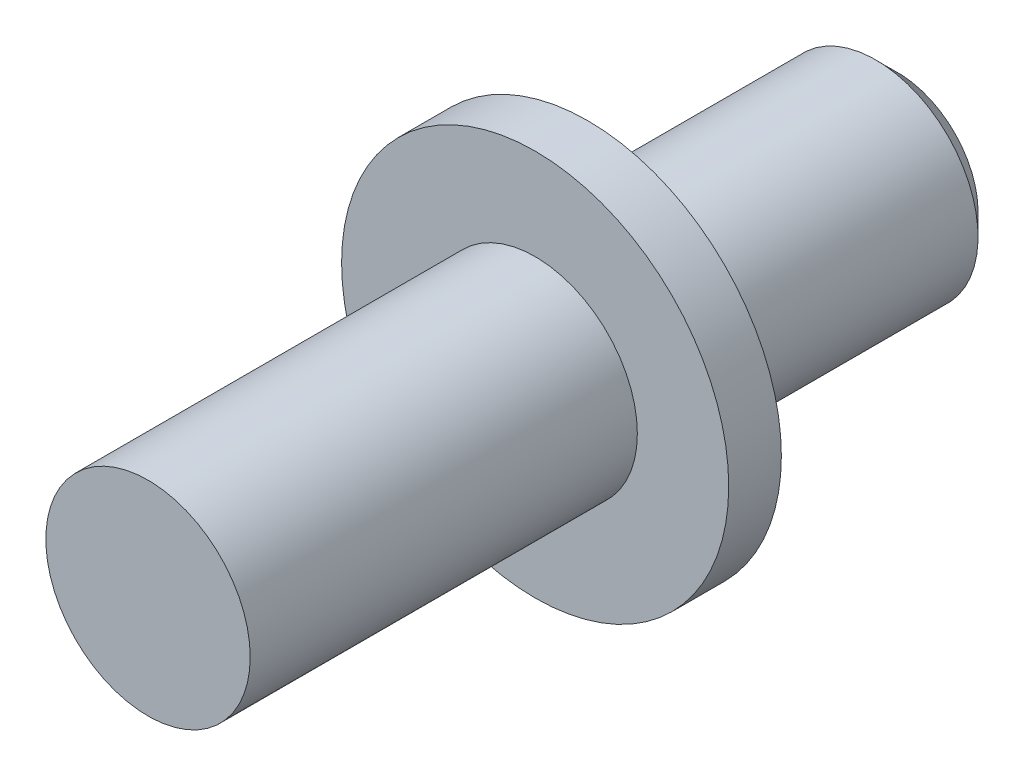
ISO-10303-21;
HEADER;
FILE_DESCRIPTION(('STEP AP214'),'2;1');
FILE_NAME('part.step','',(''),(''),'','','');
FILE_SCHEMA(('AUTOMOTIVE_DESIGN { 1 0 10303 214 1 1 1 1 }'));
ENDSEC;
DATA;
#1=APPLICATION_CONTEXT('core data for automotive mechanical design processes');
#2=APPLICATION_PROTOCOL_DEFINITION('international standard','automotive_design',2000,#1);
#3=PRODUCT_CONTEXT('',#1,'mechanical');
#4=PRODUCT('Part','Part','',(#3));
#5=PRODUCT_RELATED_PRODUCT_CATEGORY('part','',(#4));
#6=PRODUCT_DEFINITION_FORMATION('','',#4);
#7=PRODUCT_DEFINITION_CONTEXT('part definition',#1,'design');
#8=PRODUCT_DEFINITION('design','',#6,#7);
#9=PRODUCT_DEFINITION_SHAPE('','',#8);
#10=(LENGTH_UNIT() NAMED_UNIT(*) SI_UNIT(.MILLI.,.METRE.));
#11=(NAMED_UNIT(*) PLANE_ANGLE_UNIT() SI_UNIT($,.RADIAN.));
#12=(NAMED_UNIT(*) SI_UNIT($,.STERADIAN.) SOLID_ANGLE_UNIT());
#13=UNCERTAINTY_MEASURE_WITH_UNIT(LENGTH_MEASURE(1.E-05),#10,'distance_accuracy_value','');
#14=(GEOMETRIC_REPRESENTATION_CONTEXT(3) GLOBAL_UNCERTAINTY_ASSIGNED_CONTEXT((#13)) GLOBAL_UNIT_ASSIGNED_CONTEXT((#10,
#11,#12)) REPRESENTATION_CONTEXT('',''));
#15=CARTESIAN_POINT('',(0.,0.,0.));
#16=DIRECTION('',(0.,0.,1.));
#17=DIRECTION('',(1.,0.,0.));
#18=AXIS2_PLACEMENT_3D('',#15,#16,#17);
#19=CARTESIAN_POINT('',(0.,0.,-14.859));
#20=DIRECTION('',(0.,0.,1.));
#21=DIRECTION('',(1.,0.,0.));
#22=AXIS2_PLACEMENT_3D('',#19,#20,#21);
#23=PLANE('',#22);
#24=CARTESIAN_POINT('',(0.,0.,-14.8589999999444));
#25=DIRECTION('',(0.,0.,1.));
#26=DIRECTION('',(0.,-1.,0.));
#27=AXIS2_PLACEMENT_3D('',#24,#25,#26);
#28=CIRCLE('',#27,3.30200000001923);
#29=CARTESIAN_POINT('',(0.,-3.30200000001923,-14.8589999999444));
#30=VERTEX_POINT('',#29);
#31=EDGE_CURVE('E18',#30,#30,#28,.T.);
#32=ORIENTED_EDGE('',*,*,#31,.F.);
#33=EDGE_LOOP('',(#32));
#34=FACE_BOUND('',#33,.T.);
#35=ADVANCED_FACE('F15',(#34),#23,.F.);
#36=CARTESIAN_POINT('',(0.,0.,-13.9700000001426));
#37=DIRECTION('',(0.,0.,1.));
#38=DIRECTION('',(0.,-1.,0.));
#39=AXIS2_PLACEMENT_3D('',#36,#37,#38);
#40=CONICAL_SURFACE('',#39,4.19099999982109,0.785398163397448);
#41=CARTESIAN_POINT('',(0.,0.,-13.97));
#42=DIRECTION('',(0.,0.,-1.));
#43=DIRECTION('',(-1.,0.,0.));
#44=AXIS2_PLACEMENT_3D('',#41,#42,#43);
#45=CIRCLE('',#44,4.191);
#46=CARTESIAN_POINT('',(-4.191,0.,-13.97));
#47=VERTEX_POINT('',#46);
#48=EDGE_CURVE('E39',#47,#47,#45,.F.);
#49=ORIENTED_EDGE('',*,*,#48,.F.);
#50=EDGE_LOOP('',(#49));
#51=FACE_BOUND('',#50,.T.);
#52=ORIENTED_EDGE('',*,*,#31,.T.);
#53=EDGE_LOOP('',(#52));
#54=FACE_BOUND('',#53,.T.);
#55=ADVANCED_FACE('F48',(#51,#54),#40,.T.);
#56=CARTESIAN_POINT('',(0.,0.,-2.159));
#57=DIRECTION('',(0.,0.,-1.));
#58=DIRECTION('',(-1.,0.,0.));
#59=AXIS2_PLACEMENT_3D('',#56,#57,#58);
#60=CYLINDRICAL_SURFACE('',#59,4.191);
#61=ORIENTED_EDGE('',*,*,#48,.T.);
#62=EDGE_LOOP('',(#61));
#63=FACE_BOUND('',#62,.T.);
#64=CARTESIAN_POINT('',(0.,0.,-2.159));
#65=DIRECTION('',(0.,0.,-1.));
#66=DIRECTION('',(-1.,0.,0.));
#67=AXIS2_PLACEMENT_3D('',#64,#65,#66);
#68=CIRCLE('',#67,4.191);
#69=CARTESIAN_POINT('',(-4.191,0.,-2.159));
#70=VERTEX_POINT('',#69);
#71=EDGE_CURVE('E37',#70,#70,#68,.T.);
#72=ORIENTED_EDGE('',*,*,#71,.T.);
#73=EDGE_LOOP('',(#72));
#74=FACE_BOUND('',#73,.T.);
#75=ADVANCED_FACE('F55',(#63,#74),#60,.T.);
#76=CARTESIAN_POINT('',(0.,0.,-2.159));
#77=DIRECTION('',(0.,0.,1.));
#78=DIRECTION('',(1.,0.,0.));
#79=AXIS2_PLACEMENT_3D('',#76,#77,#78);
#80=PLANE('',#79);
#81=ORIENTED_EDGE('',*,*,#71,.F.);
#82=EDGE_LOOP('',(#81));
#83=FACE_BOUND('',#82,.T.);
#84=CARTESIAN_POINT('',(0.,0.,-2.159));
#85=DIRECTION('',(0.,0.,-1.));
#86=DIRECTION('',(-1.,0.,0.));
#87=AXIS2_PLACEMENT_3D('',#84,#85,#86);
#88=CIRCLE('',#87,7.9375);
#89=CARTESIAN_POINT('',(-7.9375,0.,-2.159));
#90=VERTEX_POINT('',#89);
#91=EDGE_CURVE('E35',#90,#90,#88,.F.);
#92=ORIENTED_EDGE('',*,*,#91,.F.);
#93=EDGE_LOOP('',(#92));
#94=FACE_BOUND('',#93,.T.);
#95=ADVANCED_FACE('F75',(#83,#94),#80,.F.);
#96=CARTESIAN_POINT('',(0.,0.,0.));
#97=DIRECTION('',(0.,0.,-1.));
#98=DIRECTION('',(-1.,0.,0.));
#99=AXIS2_PLACEMENT_3D('',#96,#97,#98);
#100=CYLINDRICAL_SURFACE('',#99,7.9375);
#101=CARTESIAN_POINT('',(0.,0.,0.));
#102=DIRECTION('',(0.,0.,-1.));
#103=DIRECTION('',(-1.,0.,0.));
#104=AXIS2_PLACEMENT_3D('',#101,#102,#103);
#105=CIRCLE('',#104,7.9375);
#106=CARTESIAN_POINT('',(-7.9375,0.,0.));
#107=VERTEX_POINT('',#106);
#108=EDGE_CURVE('E27',#107,#107,#105,.F.);
#109=ORIENTED_EDGE('',*,*,#108,.F.);
#110=EDGE_LOOP('',(#109));
#111=FACE_BOUND('',#110,.T.);
#112=ORIENTED_EDGE('',*,*,#91,.T.);
#113=EDGE_LOOP('',(#112));
#114=FACE_BOUND('',#113,.T.);
#115=ADVANCED_FACE('F71',(#111,#114),#100,.T.);
#116=CARTESIAN_POINT('',(0.,0.,15.875));
#117=DIRECTION('',(0.,0.,-1.));
#118=DIRECTION('',(-1.,0.,0.));
#119=AXIS2_PLACEMENT_3D('',#116,#117,#118);
#120=PLANE('',#119);
#121=CARTESIAN_POINT('',(0.,0.,15.875));
#122=DIRECTION('',(0.,0.,1.));
#123=DIRECTION('',(1.,0.,0.));
#124=AXIS2_PLACEMENT_3D('',#121,#122,#123);
#125=CIRCLE('',#124,4.191);
#126=CARTESIAN_POINT('',(4.191,0.,15.875));
#127=VERTEX_POINT('',#126);
#128=EDGE_CURVE('E22',#127,#127,#125,.F.);
#129=ORIENTED_EDGE('',*,*,#128,.F.);
#130=EDGE_LOOP('',(#129));
#131=FACE_BOUND('',#130,.T.);
#132=ADVANCED_FACE('F64',(#131),#120,.F.);
#133=CARTESIAN_POINT('',(0.,0.,0.));
#134=DIRECTION('',(0.,0.,1.));
#135=DIRECTION('',(1.,0.,0.));
#136=AXIS2_PLACEMENT_3D('',#133,#134,#135);
#137=PLANE('',#136);
#138=CARTESIAN_POINT('',(0.,0.,0.));
#139=DIRECTION('',(0.,0.,1.));
#140=DIRECTION('',(1.,0.,0.));
#141=AXIS2_PLACEMENT_3D('',#138,#139,#140);
#142=CIRCLE('',#141,4.191);
#143=CARTESIAN_POINT('',(4.191,0.,0.));
#144=VERTEX_POINT('',#143);
#145=EDGE_CURVE('E10',#144,#144,#142,.T.);
#146=ORIENTED_EDGE('',*,*,#145,.F.);
#147=EDGE_LOOP('',(#146));
#148=FACE_BOUND('',#147,.T.);
#149=ORIENTED_EDGE('',*,*,#108,.T.);
#150=EDGE_LOOP('',(#149));
#151=FACE_BOUND('',#150,.T.);
#152=ADVANCED_FACE('F59',(#148,#151),#137,.T.);
#153=CARTESIAN_POINT('',(0.,0.,0.));
#154=DIRECTION('',(0.,0.,1.));
#155=DIRECTION('',(1.,0.,0.));
#156=AXIS2_PLACEMENT_3D('',#153,#154,#155);
#157=CYLINDRICAL_SURFACE('',#156,4.191);
#158=ORIENTED_EDGE('',*,*,#145,.T.);
#159=EDGE_LOOP('',(#158));
#160=FACE_BOUND('',#159,.T.);
#161=ORIENTED_EDGE('',*,*,#128,.T.);
#162=EDGE_LOOP('',(#161));
#163=FACE_BOUND('',#162,.T.);
#164=ADVANCED_FACE('F57',(#160,#163),#157,.T.);
#165=CLOSED_SHELL('',(#35,#55,#75,#95,#115,#132,#152,#164));
#166=MANIFOLD_SOLID_BREP('B1',#165);
#167=ADVANCED_BREP_SHAPE_REPRESENTATION('',(#18,#166),#14);
#168=SHAPE_DEFINITION_REPRESENTATION(#9,#167);
ENDSEC;
END-ISO-10303-21;
